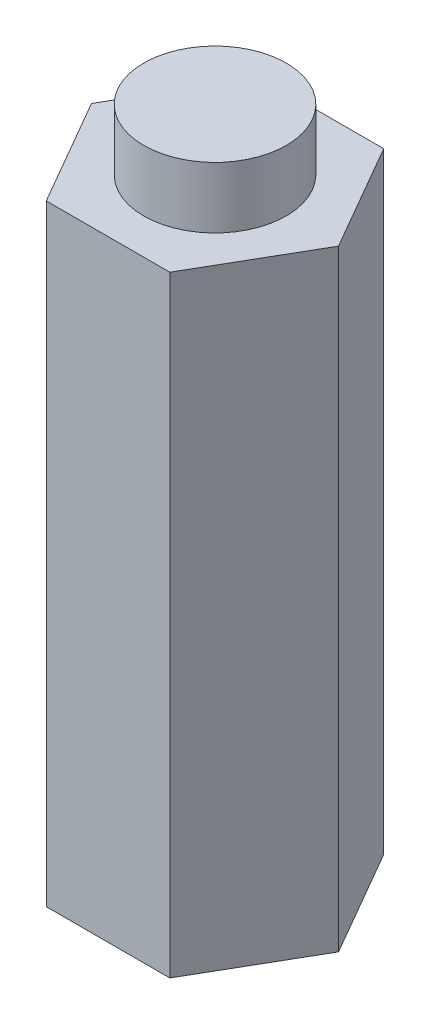
ISO-10303-21;
HEADER;
FILE_DESCRIPTION(('STEP AP214'),'2;1');
FILE_NAME('part.step','',(''),(''),'','','');
FILE_SCHEMA(('AUTOMOTIVE_DESIGN { 1 0 10303 214 1 1 1 1 }'));
ENDSEC;
DATA;
#1=APPLICATION_CONTEXT('core data for automotive mechanical design processes');
#2=APPLICATION_PROTOCOL_DEFINITION('international standard','automotive_design',2000,#1);
#3=PRODUCT_CONTEXT('',#1,'mechanical');
#4=PRODUCT('Part','Part','',(#3));
#5=PRODUCT_RELATED_PRODUCT_CATEGORY('part','',(#4));
#6=PRODUCT_DEFINITION_FORMATION('','',#4);
#7=PRODUCT_DEFINITION_CONTEXT('part definition',#1,'design');
#8=PRODUCT_DEFINITION('design','',#6,#7);
#9=PRODUCT_DEFINITION_SHAPE('','',#8);
#10=(LENGTH_UNIT() NAMED_UNIT(*) SI_UNIT(.MILLI.,.METRE.));
#11=(NAMED_UNIT(*) PLANE_ANGLE_UNIT() SI_UNIT($,.RADIAN.));
#12=(NAMED_UNIT(*) SI_UNIT($,.STERADIAN.) SOLID_ANGLE_UNIT());
#13=UNCERTAINTY_MEASURE_WITH_UNIT(LENGTH_MEASURE(1.E-05),#10,'distance_accuracy_value','');
#14=(GEOMETRIC_REPRESENTATION_CONTEXT(3) GLOBAL_UNCERTAINTY_ASSIGNED_CONTEXT((#13)) GLOBAL_UNIT_ASSIGNED_CONTEXT((#10,
#11,#12)) REPRESENTATION_CONTEXT('',''));
#15=CARTESIAN_POINT('',(0.,0.,0.));
#16=DIRECTION('',(0.,0.,1.));
#17=DIRECTION('',(1.,0.,0.));
#18=AXIS2_PLACEMENT_3D('',#15,#16,#17);
#19=CARTESIAN_POINT('',(0.,60.,10.5));
#20=DIRECTION('',(0.,0.,-1.));
#21=DIRECTION('',(-1.,0.,0.));
#22=AXIS2_PLACEMENT_3D('',#19,#20,#21);
#23=PLANE('',#22);
#24=DIRECTION('',(1.,0.,0.));
#25=VECTOR('',#24,1.);
#26=CARTESIAN_POINT('',(0.,0.,10.5));
#27=LINE('',#26,#25);
#28=CARTESIAN_POINT('',(-6.06217782649107,0.,10.5));
#29=VERTEX_POINT('',#28);
#30=CARTESIAN_POINT('',(6.06217782649107,0.,10.5));
#31=VERTEX_POINT('',#30);
#32=EDGE_CURVE('E134',#29,#31,#27,.T.);
#33=ORIENTED_EDGE('',*,*,#32,.T.);
#34=DIRECTION('',(0.,-1.,0.));
#35=VECTOR('',#34,1.);
#36=CARTESIAN_POINT('',(6.06217782649107,60.,10.5));
#37=LINE('',#36,#35);
#38=CARTESIAN_POINT('',(6.06217782649107,60.,10.5));
#39=VERTEX_POINT('',#38);
#40=EDGE_CURVE('E11',#39,#31,#37,.T.);
#41=ORIENTED_EDGE('',*,*,#40,.F.);
#42=DIRECTION('',(1.,0.,0.));
#43=VECTOR('',#42,1.);
#44=CARTESIAN_POINT('',(0.,60.,10.5));
#45=LINE('',#44,#43);
#46=CARTESIAN_POINT('',(-6.06217782649107,60.,10.5));
#47=VERTEX_POINT('',#46);
#48=EDGE_CURVE('E151',#47,#39,#45,.T.);
#49=ORIENTED_EDGE('',*,*,#48,.F.);
#50=DIRECTION('',(0.,-1.,0.));
#51=VECTOR('',#50,1.);
#52=CARTESIAN_POINT('',(-6.06217782649107,60.,10.5));
#53=LINE('',#52,#51);
#54=EDGE_CURVE('E130',#47,#29,#53,.T.);
#55=ORIENTED_EDGE('',*,*,#54,.T.);
#56=EDGE_LOOP('',(#33,#41,#49,#55));
#57=FACE_BOUND('',#56,.T.);
#58=ADVANCED_FACE('F45',(#57),#23,.F.);
#59=CARTESIAN_POINT('',(9.09326673973661,60.,5.25));
#60=DIRECTION('',(-0.866025403784439,0.,-0.5));
#61=DIRECTION('',(-0.5,0.,0.866025403784439));
#62=AXIS2_PLACEMENT_3D('',#59,#60,#61);
#63=PLANE('',#62);
#64=DIRECTION('',(0.5,0.,-0.866025403784439));
#65=VECTOR('',#64,1.);
#66=CARTESIAN_POINT('',(9.09326673973661,0.,5.25));
#67=LINE('',#66,#65);
#68=CARTESIAN_POINT('',(12.1243556529821,0.,0.));
#69=VERTEX_POINT('',#68);
#70=EDGE_CURVE('E138',#31,#69,#67,.T.);
#71=ORIENTED_EDGE('',*,*,#70,.T.);
#72=DIRECTION('',(0.,-1.,0.));
#73=VECTOR('',#72,1.);
#74=CARTESIAN_POINT('',(12.1243556529821,60.,0.));
#75=LINE('',#74,#73);
#76=CARTESIAN_POINT('',(12.1243556529821,60.,0.));
#77=VERTEX_POINT('',#76);
#78=EDGE_CURVE('E54',#77,#69,#75,.T.);
#79=ORIENTED_EDGE('',*,*,#78,.F.);
#80=DIRECTION('',(0.5,0.,-0.866025403784439));
#81=VECTOR('',#80,1.);
#82=CARTESIAN_POINT('',(9.09326673973661,60.,5.25));
#83=LINE('',#82,#81);
#84=EDGE_CURVE('E99',#39,#77,#83,.T.);
#85=ORIENTED_EDGE('',*,*,#84,.F.);
#86=ORIENTED_EDGE('',*,*,#40,.T.);
#87=EDGE_LOOP('',(#71,#79,#85,#86));
#88=FACE_BOUND('',#87,.T.);
#89=ADVANCED_FACE('F180',(#88),#63,.F.);
#90=CARTESIAN_POINT('',(9.09326673973661,60.,-5.25));
#91=DIRECTION('',(-0.866025403784439,0.,0.5));
#92=DIRECTION('',(0.5,0.,0.866025403784439));
#93=AXIS2_PLACEMENT_3D('',#90,#91,#92);
#94=PLANE('',#93);
#95=DIRECTION('',(-0.5,0.,-0.866025403784439));
#96=VECTOR('',#95,1.);
#97=CARTESIAN_POINT('',(9.09326673973661,0.,-5.25));
#98=LINE('',#97,#96);
#99=CARTESIAN_POINT('',(6.06217782649108,0.,-10.5));
#100=VERTEX_POINT('',#99);
#101=EDGE_CURVE('E142',#69,#100,#98,.T.);
#102=ORIENTED_EDGE('',*,*,#101,.T.);
#103=DIRECTION('',(0.,-1.,0.));
#104=VECTOR('',#103,1.);
#105=CARTESIAN_POINT('',(6.06217782649108,60.,-10.5));
#106=LINE('',#105,#104);
#107=CARTESIAN_POINT('',(6.06217782649108,60.,-10.5));
#108=VERTEX_POINT('',#107);
#109=EDGE_CURVE('E123',#108,#100,#106,.T.);
#110=ORIENTED_EDGE('',*,*,#109,.F.);
#111=DIRECTION('',(-0.5,0.,-0.866025403784439));
#112=VECTOR('',#111,1.);
#113=CARTESIAN_POINT('',(9.09326673973661,60.,-5.25));
#114=LINE('',#113,#112);
#115=EDGE_CURVE('E112',#77,#108,#114,.T.);
#116=ORIENTED_EDGE('',*,*,#115,.F.);
#117=ORIENTED_EDGE('',*,*,#78,.T.);
#118=EDGE_LOOP('',(#102,#110,#116,#117));
#119=FACE_BOUND('',#118,.T.);
#120=ADVANCED_FACE('F161',(#119),#94,.F.);
#121=CARTESIAN_POINT('',(0.,60.,-10.5));
#122=DIRECTION('',(0.,0.,1.));
#123=DIRECTION('',(1.,0.,0.));
#124=AXIS2_PLACEMENT_3D('',#121,#122,#123);
#125=PLANE('',#124);
#126=DIRECTION('',(-1.,0.,0.));
#127=VECTOR('',#126,1.);
#128=CARTESIAN_POINT('',(0.,0.,-10.5));
#129=LINE('',#128,#127);
#130=CARTESIAN_POINT('',(-6.06217782649107,0.,-10.5));
#131=VERTEX_POINT('',#130);
#132=EDGE_CURVE('E121',#100,#131,#129,.T.);
#133=ORIENTED_EDGE('',*,*,#132,.T.);
#134=DIRECTION('',(0.,-1.,0.));
#135=VECTOR('',#134,1.);
#136=CARTESIAN_POINT('',(-6.06217782649107,60.,-10.5));
#137=LINE('',#136,#135);
#138=CARTESIAN_POINT('',(-6.06217782649107,60.,-10.5));
#139=VERTEX_POINT('',#138);
#140=EDGE_CURVE('E118',#139,#131,#137,.T.);
#141=ORIENTED_EDGE('',*,*,#140,.F.);
#142=DIRECTION('',(-1.,0.,0.));
#143=VECTOR('',#142,1.);
#144=CARTESIAN_POINT('',(0.,60.,-10.5));
#145=LINE('',#144,#143);
#146=EDGE_CURVE('E106',#108,#139,#145,.T.);
#147=ORIENTED_EDGE('',*,*,#146,.F.);
#148=ORIENTED_EDGE('',*,*,#109,.T.);
#149=EDGE_LOOP('',(#133,#141,#147,#148));
#150=FACE_BOUND('',#149,.T.);
#151=ADVANCED_FACE('F119',(#150),#125,.F.);
#152=CARTESIAN_POINT('',(-9.0932667397366,60.,-5.25));
#153=DIRECTION('',(0.866025403784439,0.,0.5));
#154=DIRECTION('',(0.5,0.,-0.866025403784439));
#155=AXIS2_PLACEMENT_3D('',#152,#153,#154);
#156=PLANE('',#155);
#157=DIRECTION('',(-0.5,0.,0.866025403784439));
#158=VECTOR('',#157,1.);
#159=CARTESIAN_POINT('',(-9.0932667397366,0.,-5.25));
#160=LINE('',#159,#158);
#161=CARTESIAN_POINT('',(-12.1243556529821,0.,0.));
#162=VERTEX_POINT('',#161);
#163=EDGE_CURVE('E85',#131,#162,#160,.T.);
#164=ORIENTED_EDGE('',*,*,#163,.T.);
#165=DIRECTION('',(0.,-1.,0.));
#166=VECTOR('',#165,1.);
#167=CARTESIAN_POINT('',(-12.1243556529821,60.,0.));
#168=LINE('',#167,#166);
#169=CARTESIAN_POINT('',(-12.1243556529821,60.,0.));
#170=VERTEX_POINT('',#169);
#171=EDGE_CURVE('E124',#170,#162,#168,.T.);
#172=ORIENTED_EDGE('',*,*,#171,.F.);
#173=DIRECTION('',(-0.5,0.,0.866025403784439));
#174=VECTOR('',#173,1.);
#175=CARTESIAN_POINT('',(-9.0932667397366,60.,-5.25));
#176=LINE('',#175,#174);
#177=EDGE_CURVE('E110',#139,#170,#176,.T.);
#178=ORIENTED_EDGE('',*,*,#177,.F.);
#179=ORIENTED_EDGE('',*,*,#140,.T.);
#180=EDGE_LOOP('',(#164,#172,#178,#179));
#181=FACE_BOUND('',#180,.T.);
#182=ADVANCED_FACE('F126',(#181),#156,.F.);
#183=CARTESIAN_POINT('',(-9.09326673973661,60.,5.25));
#184=DIRECTION('',(0.866025403784439,0.,-0.5));
#185=DIRECTION('',(-0.5,0.,-0.866025403784439));
#186=AXIS2_PLACEMENT_3D('',#183,#184,#185);
#187=PLANE('',#186);
#188=DIRECTION('',(0.5,0.,0.866025403784439));
#189=VECTOR('',#188,1.);
#190=CARTESIAN_POINT('',(-9.09326673973661,0.,5.25));
#191=LINE('',#190,#189);
#192=EDGE_CURVE('E91',#162,#29,#191,.T.);
#193=ORIENTED_EDGE('',*,*,#192,.T.);
#194=ORIENTED_EDGE('',*,*,#54,.F.);
#195=DIRECTION('',(0.5,0.,0.866025403784439));
#196=VECTOR('',#195,1.);
#197=CARTESIAN_POINT('',(-9.09326673973661,60.,5.25));
#198=LINE('',#197,#196);
#199=EDGE_CURVE('E62',#170,#47,#198,.T.);
#200=ORIENTED_EDGE('',*,*,#199,.F.);
#201=ORIENTED_EDGE('',*,*,#171,.T.);
#202=EDGE_LOOP('',(#193,#194,#200,#201));
#203=FACE_BOUND('',#202,.T.);
#204=ADVANCED_FACE('F168',(#203),#187,.F.);
#205=CARTESIAN_POINT('',(0.,60.,0.));
#206=DIRECTION('',(0.,1.,0.));
#207=DIRECTION('',(0.,0.,1.));
#208=AXIS2_PLACEMENT_3D('',#205,#206,#207);
#209=PLANE('',#208);
#210=CARTESIAN_POINT('',(0.,60.,0.));
#211=DIRECTION('',(0.,1.,0.));
#212=DIRECTION('',(0.,0.,1.));
#213=AXIS2_PLACEMENT_3D('',#210,#211,#212);
#214=CIRCLE('',#213,7.);
#215=CARTESIAN_POINT('',(0.,60.,7.));
#216=VERTEX_POINT('',#215);
#217=EDGE_CURVE('E139',#216,#216,#214,.F.);
#218=ORIENTED_EDGE('',*,*,#217,.T.);
#219=EDGE_LOOP('',(#218));
#220=FACE_BOUND('',#219,.T.);
#221=ORIENTED_EDGE('',*,*,#48,.T.);
#222=ORIENTED_EDGE('',*,*,#84,.T.);
#223=ORIENTED_EDGE('',*,*,#115,.T.);
#224=ORIENTED_EDGE('',*,*,#146,.T.);
#225=ORIENTED_EDGE('',*,*,#177,.T.);
#226=ORIENTED_EDGE('',*,*,#199,.T.);
#227=EDGE_LOOP('',(#221,#222,#223,#224,#225,#226));
#228=FACE_BOUND('',#227,.T.);
#229=ADVANCED_FACE('F108',(#220,#228),#209,.T.);
#230=CARTESIAN_POINT('',(0.,0.,0.));
#231=DIRECTION('',(0.,1.,0.));
#232=DIRECTION('',(0.,0.,1.));
#233=AXIS2_PLACEMENT_3D('',#230,#231,#232);
#234=PLANE('',#233);
#235=ORIENTED_EDGE('',*,*,#32,.F.);
#236=ORIENTED_EDGE('',*,*,#192,.F.);
#237=ORIENTED_EDGE('',*,*,#163,.F.);
#238=ORIENTED_EDGE('',*,*,#132,.F.);
#239=ORIENTED_EDGE('',*,*,#101,.F.);
#240=ORIENTED_EDGE('',*,*,#70,.F.);
#241=EDGE_LOOP('',(#235,#236,#237,#238,#239,#240));
#242=FACE_BOUND('',#241,.T.);
#243=ADVANCED_FACE('F164',(#242),#234,.F.);
#244=CARTESIAN_POINT('',(0.,66.,0.));
#245=DIRECTION('',(0.,-1.,0.));
#246=DIRECTION('',(0.,0.,-1.));
#247=AXIS2_PLACEMENT_3D('',#244,#245,#246);
#248=CYLINDRICAL_SURFACE('',#247,7.);
#249=ORIENTED_EDGE('',*,*,#217,.F.);
#250=EDGE_LOOP('',(#249));
#251=FACE_BOUND('',#250,.T.);
#252=CARTESIAN_POINT('',(0.,66.,0.));
#253=DIRECTION('',(0.,1.,0.));
#254=DIRECTION('',(0.,0.,1.));
#255=AXIS2_PLACEMENT_3D('',#252,#253,#254);
#256=CIRCLE('',#255,7.);
#257=CARTESIAN_POINT('',(0.,66.,7.));
#258=VERTEX_POINT('',#257);
#259=EDGE_CURVE('E242',#258,#258,#256,.T.);
#260=ORIENTED_EDGE('',*,*,#259,.F.);
#261=EDGE_LOOP('',(#260));
#262=FACE_BOUND('',#261,.T.);
#263=ADVANCED_FACE('F219',(#251,#262),#248,.T.);
#264=CARTESIAN_POINT('',(0.,66.,0.));
#265=DIRECTION('',(0.,1.,0.));
#266=DIRECTION('',(0.,0.,1.));
#267=AXIS2_PLACEMENT_3D('',#264,#265,#266);
#268=PLANE('',#267);
#269=ORIENTED_EDGE('',*,*,#259,.T.);
#270=EDGE_LOOP('',(#269));
#271=FACE_BOUND('',#270,.T.);
#272=ADVANCED_FACE('F227',(#271),#268,.T.);
#273=CLOSED_SHELL('',(#58,#89,#120,#151,#182,#204,#229,#243,#263,#272));
#274=MANIFOLD_SOLID_BREP('B2',#273);
#275=ADVANCED_BREP_SHAPE_REPRESENTATION('',(#18,#274),#14);
#276=SHAPE_DEFINITION_REPRESENTATION(#9,#275);
ENDSEC;
END-ISO-10303-21;
